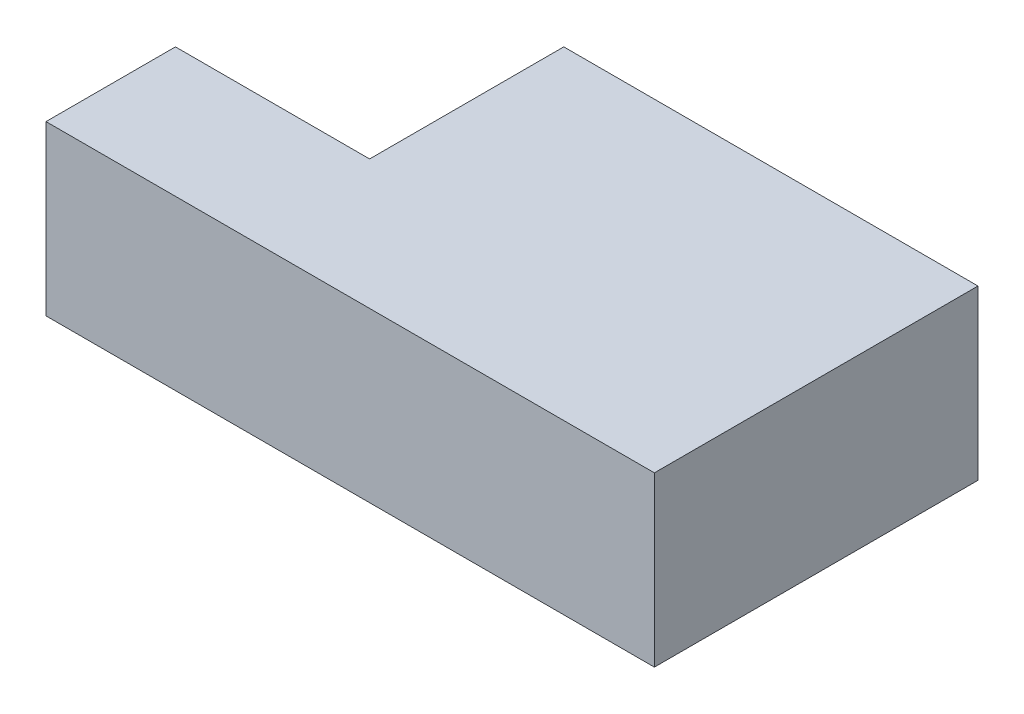
ISO-10303-21;
HEADER;
FILE_DESCRIPTION(('STEP AP214'),'2;1');
FILE_NAME('part.step','',(''),(''),'','','');
FILE_SCHEMA(('AUTOMOTIVE_DESIGN { 1 0 10303 214 1 1 1 1 }'));
ENDSEC;
DATA;
#1=APPLICATION_CONTEXT('core data for automotive mechanical design processes');
#2=APPLICATION_PROTOCOL_DEFINITION('international standard','automotive_design',2000,#1);
#3=PRODUCT_CONTEXT('',#1,'mechanical');
#4=PRODUCT('Part','Part','',(#3));
#5=PRODUCT_RELATED_PRODUCT_CATEGORY('part','',(#4));
#6=PRODUCT_DEFINITION_FORMATION('','',#4);
#7=PRODUCT_DEFINITION_CONTEXT('part definition',#1,'design');
#8=PRODUCT_DEFINITION('design','',#6,#7);
#9=PRODUCT_DEFINITION_SHAPE('','',#8);
#10=(LENGTH_UNIT() NAMED_UNIT(*) SI_UNIT(.MILLI.,.METRE.));
#11=(NAMED_UNIT(*) PLANE_ANGLE_UNIT() SI_UNIT($,.RADIAN.));
#12=(NAMED_UNIT(*) SI_UNIT($,.STERADIAN.) SOLID_ANGLE_UNIT());
#13=UNCERTAINTY_MEASURE_WITH_UNIT(LENGTH_MEASURE(1.E-05),#10,'distance_accuracy_value','');
#14=(GEOMETRIC_REPRESENTATION_CONTEXT(3) GLOBAL_UNCERTAINTY_ASSIGNED_CONTEXT((#13)) GLOBAL_UNIT_ASSIGNED_CONTEXT((#10,
#11,#12)) REPRESENTATION_CONTEXT('',''));
#15=CARTESIAN_POINT('',(0.,0.,0.));
#16=DIRECTION('',(0.,0.,1.));
#17=DIRECTION('',(1.,0.,0.));
#18=AXIS2_PLACEMENT_3D('',#15,#16,#17);
#19=CARTESIAN_POINT('',(-47.,13.,0.));
#20=DIRECTION('',(0.,0.,-1.));
#21=DIRECTION('',(-1.,0.,0.));
#22=AXIS2_PLACEMENT_3D('',#19,#20,#21);
#23=PLANE('',#22);
#24=DIRECTION('',(1.,0.,0.));
#25=VECTOR('',#24,1.);
#26=CARTESIAN_POINT('',(-47.,0.,0.));
#27=LINE('',#26,#25);
#28=CARTESIAN_POINT('',(-47.,0.,0.));
#29=VERTEX_POINT('',#28);
#30=CARTESIAN_POINT('',(0.,0.,0.));
#31=VERTEX_POINT('',#30);
#32=EDGE_CURVE('E131',#29,#31,#27,.T.);
#33=ORIENTED_EDGE('',*,*,#32,.T.);
#34=DIRECTION('',(0.,-1.,0.));
#35=VECTOR('',#34,1.);
#36=CARTESIAN_POINT('',(0.,13.,0.));
#37=LINE('',#36,#35);
#38=CARTESIAN_POINT('',(0.,13.,0.));
#39=VERTEX_POINT('',#38);
#40=EDGE_CURVE('E12',#39,#31,#37,.T.);
#41=ORIENTED_EDGE('',*,*,#40,.F.);
#42=DIRECTION('',(1.,0.,0.));
#43=VECTOR('',#42,1.);
#44=CARTESIAN_POINT('',(-47.,13.,0.));
#45=LINE('',#44,#43);
#46=CARTESIAN_POINT('',(-47.,13.,0.));
#47=VERTEX_POINT('',#46);
#48=EDGE_CURVE('E143',#47,#39,#45,.T.);
#49=ORIENTED_EDGE('',*,*,#48,.F.);
#50=DIRECTION('',(0.,-1.,0.));
#51=VECTOR('',#50,1.);
#52=CARTESIAN_POINT('',(-47.,13.,0.));
#53=LINE('',#52,#51);
#54=EDGE_CURVE('E127',#47,#29,#53,.T.);
#55=ORIENTED_EDGE('',*,*,#54,.T.);
#56=EDGE_LOOP('',(#33,#41,#49,#55));
#57=FACE_BOUND('',#56,.T.);
#58=ADVANCED_FACE('F35',(#57),#23,.F.);
#59=CARTESIAN_POINT('',(0.,13.,0.));
#60=DIRECTION('',(-1.,0.,0.));
#61=DIRECTION('',(0.,0.,1.));
#62=AXIS2_PLACEMENT_3D('',#59,#60,#61);
#63=PLANE('',#62);
#64=DIRECTION('',(0.,0.,-1.));
#65=VECTOR('',#64,1.);
#66=CARTESIAN_POINT('',(0.,0.,0.));
#67=LINE('',#66,#65);
#68=CARTESIAN_POINT('',(0.,0.,-25.));
#69=VERTEX_POINT('',#68);
#70=EDGE_CURVE('E134',#31,#69,#67,.T.);
#71=ORIENTED_EDGE('',*,*,#70,.T.);
#72=DIRECTION('',(0.,-1.,0.));
#73=VECTOR('',#72,1.);
#74=CARTESIAN_POINT('',(0.,13.,-25.));
#75=LINE('',#74,#73);
#76=CARTESIAN_POINT('',(0.,13.,-25.));
#77=VERTEX_POINT('',#76);
#78=EDGE_CURVE('E42',#77,#69,#75,.T.);
#79=ORIENTED_EDGE('',*,*,#78,.F.);
#80=DIRECTION('',(0.,0.,-1.));
#81=VECTOR('',#80,1.);
#82=CARTESIAN_POINT('',(0.,13.,0.));
#83=LINE('',#82,#81);
#84=EDGE_CURVE('E93',#39,#77,#83,.T.);
#85=ORIENTED_EDGE('',*,*,#84,.F.);
#86=ORIENTED_EDGE('',*,*,#40,.T.);
#87=EDGE_LOOP('',(#71,#79,#85,#86));
#88=FACE_BOUND('',#87,.T.);
#89=ADVANCED_FACE('F265',(#88),#63,.F.);
#90=CARTESIAN_POINT('',(0.,13.,-25.));
#91=DIRECTION('',(0.,0.,1.));
#92=DIRECTION('',(1.,0.,0.));
#93=AXIS2_PLACEMENT_3D('',#90,#91,#92);
#94=PLANE('',#93);
#95=DIRECTION('',(-1.,0.,0.));
#96=VECTOR('',#95,1.);
#97=CARTESIAN_POINT('',(0.,0.,-25.));
#98=LINE('',#97,#96);
#99=CARTESIAN_POINT('',(-32.,0.,-25.));
#100=VERTEX_POINT('',#99);
#101=EDGE_CURVE('E137',#69,#100,#98,.T.);
#102=ORIENTED_EDGE('',*,*,#101,.T.);
#103=DIRECTION('',(0.,-1.,0.));
#104=VECTOR('',#103,1.);
#105=CARTESIAN_POINT('',(-32.,13.,-25.));
#106=LINE('',#105,#104);
#107=CARTESIAN_POINT('',(-32.,13.,-25.));
#108=VERTEX_POINT('',#107);
#109=EDGE_CURVE('E122',#108,#100,#106,.T.);
#110=ORIENTED_EDGE('',*,*,#109,.F.);
#111=DIRECTION('',(-1.,0.,0.));
#112=VECTOR('',#111,1.);
#113=CARTESIAN_POINT('',(0.,13.,-25.));
#114=LINE('',#113,#112);
#115=EDGE_CURVE('E110',#77,#108,#114,.T.);
#116=ORIENTED_EDGE('',*,*,#115,.F.);
#117=ORIENTED_EDGE('',*,*,#78,.T.);
#118=EDGE_LOOP('',(#102,#110,#116,#117));
#119=FACE_BOUND('',#118,.T.);
#120=ADVANCED_FACE('F149',(#119),#94,.F.);
#121=CARTESIAN_POINT('',(-32.,13.,-25.));
#122=DIRECTION('',(1.,0.,0.));
#123=DIRECTION('',(0.,0.,-1.));
#124=AXIS2_PLACEMENT_3D('',#121,#122,#123);
#125=PLANE('',#124);
#126=DIRECTION('',(0.,0.,1.));
#127=VECTOR('',#126,1.);
#128=CARTESIAN_POINT('',(-32.,0.,-25.));
#129=LINE('',#128,#127);
#130=CARTESIAN_POINT('',(-32.,0.,-10.));
#131=VERTEX_POINT('',#130);
#132=EDGE_CURVE('E119',#100,#131,#129,.T.);
#133=ORIENTED_EDGE('',*,*,#132,.T.);
#134=DIRECTION('',(0.,-1.,0.));
#135=VECTOR('',#134,1.);
#136=CARTESIAN_POINT('',(-32.,13.,-10.));
#137=LINE('',#136,#135);
#138=CARTESIAN_POINT('',(-32.,13.,-10.));
#139=VERTEX_POINT('',#138);
#140=EDGE_CURVE('E116',#139,#131,#137,.T.);
#141=ORIENTED_EDGE('',*,*,#140,.F.);
#142=DIRECTION('',(0.,0.,1.));
#143=VECTOR('',#142,1.);
#144=CARTESIAN_POINT('',(-32.,13.,-25.));
#145=LINE('',#144,#143);
#146=EDGE_CURVE('E103',#108,#139,#145,.T.);
#147=ORIENTED_EDGE('',*,*,#146,.F.);
#148=ORIENTED_EDGE('',*,*,#109,.T.);
#149=EDGE_LOOP('',(#133,#141,#147,#148));
#150=FACE_BOUND('',#149,.T.);
#151=ADVANCED_FACE('F117',(#150),#125,.F.);
#152=CARTESIAN_POINT('',(-32.,13.,-10.));
#153=DIRECTION('',(0.,0.,1.));
#154=DIRECTION('',(1.,0.,0.));
#155=AXIS2_PLACEMENT_3D('',#152,#153,#154);
#156=PLANE('',#155);
#157=DIRECTION('',(-1.,0.,0.));
#158=VECTOR('',#157,1.);
#159=CARTESIAN_POINT('',(-32.,0.,-10.));
#160=LINE('',#159,#158);
#161=CARTESIAN_POINT('',(-47.,0.,-10.));
#162=VERTEX_POINT('',#161);
#163=EDGE_CURVE('E140',#131,#162,#160,.T.);
#164=ORIENTED_EDGE('',*,*,#163,.T.);
#165=DIRECTION('',(0.,-1.,0.));
#166=VECTOR('',#165,1.);
#167=CARTESIAN_POINT('',(-47.,13.,-10.));
#168=LINE('',#167,#166);
#169=CARTESIAN_POINT('',(-47.,13.,-10.));
#170=VERTEX_POINT('',#169);
#171=EDGE_CURVE('E123',#170,#162,#168,.T.);
#172=ORIENTED_EDGE('',*,*,#171,.F.);
#173=DIRECTION('',(-1.,0.,0.));
#174=VECTOR('',#173,1.);
#175=CARTESIAN_POINT('',(-32.,13.,-10.));
#176=LINE('',#175,#174);
#177=EDGE_CURVE('E107',#139,#170,#176,.T.);
#178=ORIENTED_EDGE('',*,*,#177,.F.);
#179=ORIENTED_EDGE('',*,*,#140,.T.);
#180=EDGE_LOOP('',(#164,#172,#178,#179));
#181=FACE_BOUND('',#180,.T.);
#182=ADVANCED_FACE('F125',(#181),#156,.F.);
#183=CARTESIAN_POINT('',(-47.,13.,-10.));
#184=DIRECTION('',(1.,0.,0.));
#185=DIRECTION('',(0.,0.,-1.));
#186=AXIS2_PLACEMENT_3D('',#183,#184,#185);
#187=PLANE('',#186);
#188=DIRECTION('',(0.,0.,1.));
#189=VECTOR('',#188,1.);
#190=CARTESIAN_POINT('',(-47.,0.,-10.));
#191=LINE('',#190,#189);
#192=EDGE_CURVE('E85',#162,#29,#191,.T.);
#193=ORIENTED_EDGE('',*,*,#192,.T.);
#194=ORIENTED_EDGE('',*,*,#54,.F.);
#195=DIRECTION('',(0.,0.,1.));
#196=VECTOR('',#195,1.);
#197=CARTESIAN_POINT('',(-47.,13.,-10.));
#198=LINE('',#197,#196);
#199=EDGE_CURVE('E58',#170,#47,#198,.T.);
#200=ORIENTED_EDGE('',*,*,#199,.F.);
#201=ORIENTED_EDGE('',*,*,#171,.T.);
#202=EDGE_LOOP('',(#193,#194,#200,#201));
#203=FACE_BOUND('',#202,.T.);
#204=ADVANCED_FACE('F153',(#203),#187,.F.);
#205=CARTESIAN_POINT('',(0.,13.,0.));
#206=DIRECTION('',(0.,1.,0.));
#207=DIRECTION('',(0.,0.,1.));
#208=AXIS2_PLACEMENT_3D('',#205,#206,#207);
#209=PLANE('',#208);
#210=ORIENTED_EDGE('',*,*,#48,.T.);
#211=ORIENTED_EDGE('',*,*,#84,.T.);
#212=ORIENTED_EDGE('',*,*,#115,.T.);
#213=ORIENTED_EDGE('',*,*,#146,.T.);
#214=ORIENTED_EDGE('',*,*,#177,.T.);
#215=ORIENTED_EDGE('',*,*,#199,.T.);
#216=EDGE_LOOP('',(#210,#211,#212,#213,#214,#215));
#217=FACE_BOUND('',#216,.T.);
#218=ADVANCED_FACE('F105',(#217),#209,.T.);
#219=CARTESIAN_POINT('',(0.,0.,0.));
#220=DIRECTION('',(0.,1.,0.));
#221=DIRECTION('',(0.,0.,1.));
#222=AXIS2_PLACEMENT_3D('',#219,#220,#221);
#223=PLANE('',#222);
#224=DIRECTION('',(0.,0.,-1.));
#225=VECTOR('',#224,1.);
#226=CARTESIAN_POINT('',(-45.,0.,-2.));
#227=LINE('',#226,#225);
#228=CARTESIAN_POINT('',(-45.,0.,-2.));
#229=VERTEX_POINT('',#228);
#230=CARTESIAN_POINT('',(-45.,0.,-8.));
#231=VERTEX_POINT('',#230);
#232=EDGE_CURVE('E199',#229,#231,#227,.T.);
#233=ORIENTED_EDGE('',*,*,#232,.F.);
#234=DIRECTION('',(-1.,0.,0.));
#235=VECTOR('',#234,1.);
#236=CARTESIAN_POINT('',(-2.,0.,-2.));
#237=LINE('',#236,#235);
#238=CARTESIAN_POINT('',(-2.,0.,-2.));
#239=VERTEX_POINT('',#238);
#240=EDGE_CURVE('E196',#239,#229,#237,.T.);
#241=ORIENTED_EDGE('',*,*,#240,.F.);
#242=DIRECTION('',(0.,0.,1.));
#243=VECTOR('',#242,1.);
#244=CARTESIAN_POINT('',(-2.00000000000001,0.,-23.));
#245=LINE('',#244,#243);
#246=CARTESIAN_POINT('',(-2.00000000000001,0.,-23.));
#247=VERTEX_POINT('',#246);
#248=EDGE_CURVE('E193',#247,#239,#245,.T.);
#249=ORIENTED_EDGE('',*,*,#248,.F.);
#250=DIRECTION('',(1.,0.,0.));
#251=VECTOR('',#250,1.);
#252=CARTESIAN_POINT('',(-30.,0.,-23.));
#253=LINE('',#252,#251);
#254=CARTESIAN_POINT('',(-30.,0.,-23.));
#255=VERTEX_POINT('',#254);
#256=EDGE_CURVE('E49',#255,#247,#253,.T.);
#257=ORIENTED_EDGE('',*,*,#256,.F.);
#258=DIRECTION('',(0.,0.,-1.));
#259=VECTOR('',#258,1.);
#260=CARTESIAN_POINT('',(-30.,0.,-8.));
#261=LINE('',#260,#259);
#262=CARTESIAN_POINT('',(-30.,0.,-8.));
#263=VERTEX_POINT('',#262);
#264=EDGE_CURVE('E205',#263,#255,#261,.T.);
#265=ORIENTED_EDGE('',*,*,#264,.F.);
#266=DIRECTION('',(1.,0.,0.));
#267=VECTOR('',#266,1.);
#268=CARTESIAN_POINT('',(-45.,0.,-8.));
#269=LINE('',#268,#267);
#270=EDGE_CURVE('E202',#231,#263,#269,.T.);
#271=ORIENTED_EDGE('',*,*,#270,.F.);
#272=EDGE_LOOP('',(#233,#241,#249,#257,#265,#271));
#273=FACE_BOUND('',#272,.T.);
#274=ORIENTED_EDGE('',*,*,#32,.F.);
#275=ORIENTED_EDGE('',*,*,#192,.F.);
#276=ORIENTED_EDGE('',*,*,#163,.F.);
#277=ORIENTED_EDGE('',*,*,#132,.F.);
#278=ORIENTED_EDGE('',*,*,#101,.F.);
#279=ORIENTED_EDGE('',*,*,#70,.F.);
#280=EDGE_LOOP('',(#274,#275,#276,#277,#278,#279));
#281=FACE_BOUND('',#280,.T.);
#282=ADVANCED_FACE('F152',(#273,#281),#223,.F.);
#283=CARTESIAN_POINT('',(0.,11.,0.));
#284=DIRECTION('',(0.,1.,0.));
#285=DIRECTION('',(0.,0.,1.));
#286=AXIS2_PLACEMENT_3D('',#283,#284,#285);
#287=PLANE('',#286);
#288=DIRECTION('',(0.,0.,1.));
#289=VECTOR('',#288,1.);
#290=CARTESIAN_POINT('',(-2.00000000000001,11.,-23.));
#291=LINE('',#290,#289);
#292=CARTESIAN_POINT('',(-2.00000000000001,11.,-23.));
#293=VERTEX_POINT('',#292);
#294=CARTESIAN_POINT('',(-2.,11.,-2.));
#295=VERTEX_POINT('',#294);
#296=EDGE_CURVE('E162',#293,#295,#291,.T.);
#297=ORIENTED_EDGE('',*,*,#296,.T.);
#298=DIRECTION('',(-1.,0.,0.));
#299=VECTOR('',#298,1.);
#300=CARTESIAN_POINT('',(-2.,11.,-2.));
#301=LINE('',#300,#299);
#302=CARTESIAN_POINT('',(-45.,11.,-2.));
#303=VERTEX_POINT('',#302);
#304=EDGE_CURVE('E167',#295,#303,#301,.T.);
#305=ORIENTED_EDGE('',*,*,#304,.T.);
#306=DIRECTION('',(0.,0.,-1.));
#307=VECTOR('',#306,1.);
#308=CARTESIAN_POINT('',(-45.,11.,-2.));
#309=LINE('',#308,#307);
#310=CARTESIAN_POINT('',(-45.,11.,-8.));
#311=VERTEX_POINT('',#310);
#312=EDGE_CURVE('E166',#303,#311,#309,.T.);
#313=ORIENTED_EDGE('',*,*,#312,.T.);
#314=DIRECTION('',(1.,0.,0.));
#315=VECTOR('',#314,1.);
#316=CARTESIAN_POINT('',(-45.,11.,-8.));
#317=LINE('',#316,#315);
#318=CARTESIAN_POINT('',(-30.,11.,-8.));
#319=VERTEX_POINT('',#318);
#320=EDGE_CURVE('E171',#311,#319,#317,.T.);
#321=ORIENTED_EDGE('',*,*,#320,.T.);
#322=DIRECTION('',(0.,0.,-1.));
#323=VECTOR('',#322,1.);
#324=CARTESIAN_POINT('',(-30.,11.,-8.));
#325=LINE('',#324,#323);
#326=CARTESIAN_POINT('',(-30.,11.,-23.));
#327=VERTEX_POINT('',#326);
#328=EDGE_CURVE('E175',#319,#327,#325,.T.);
#329=ORIENTED_EDGE('',*,*,#328,.T.);
#330=DIRECTION('',(1.,0.,0.));
#331=VECTOR('',#330,1.);
#332=CARTESIAN_POINT('',(-30.,11.,-23.));
#333=LINE('',#332,#331);
#334=EDGE_CURVE('E178',#327,#293,#333,.T.);
#335=ORIENTED_EDGE('',*,*,#334,.T.);
#336=EDGE_LOOP('',(#297,#305,#313,#321,#329,#335));
#337=FACE_BOUND('',#336,.T.);
#338=ADVANCED_FACE('F254',(#337),#287,.F.);
#339=CARTESIAN_POINT('',(-2.,60.8539444560216,-2.));
#340=DIRECTION('',(0.,0.,1.));
#341=DIRECTION('',(1.,0.,0.));
#342=AXIS2_PLACEMENT_3D('',#339,#340,#341);
#343=PLANE('',#342);
#344=DIRECTION('',(0.,-1.,0.));
#345=VECTOR('',#344,1.);
#346=CARTESIAN_POINT('',(-2.,60.8539444560216,-2.));
#347=LINE('',#346,#345);
#348=EDGE_CURVE('E135',#295,#239,#347,.T.);
#349=ORIENTED_EDGE('',*,*,#348,.T.);
#350=ORIENTED_EDGE('',*,*,#240,.T.);
#351=DIRECTION('',(0.,-1.,0.));
#352=VECTOR('',#351,1.);
#353=CARTESIAN_POINT('',(-45.,60.8539444560216,-2.));
#354=LINE('',#353,#352);
#355=EDGE_CURVE('E163',#303,#229,#354,.T.);
#356=ORIENTED_EDGE('',*,*,#355,.F.);
#357=ORIENTED_EDGE('',*,*,#304,.F.);
#358=EDGE_LOOP('',(#349,#350,#356,#357));
#359=FACE_BOUND('',#358,.T.);
#360=ADVANCED_FACE('F251',(#359),#343,.F.);
#361=CARTESIAN_POINT('',(-45.,60.8539444560216,-2.));
#362=DIRECTION('',(-1.,0.,0.));
#363=DIRECTION('',(0.,0.,1.));
#364=AXIS2_PLACEMENT_3D('',#361,#362,#363);
#365=PLANE('',#364);
#366=ORIENTED_EDGE('',*,*,#355,.T.);
#367=ORIENTED_EDGE('',*,*,#232,.T.);
#368=DIRECTION('',(0.,-1.,0.));
#369=VECTOR('',#368,1.);
#370=CARTESIAN_POINT('',(-45.,60.8539444560216,-8.));
#371=LINE('',#370,#369);
#372=EDGE_CURVE('E168',#311,#231,#371,.T.);
#373=ORIENTED_EDGE('',*,*,#372,.F.);
#374=ORIENTED_EDGE('',*,*,#312,.F.);
#375=EDGE_LOOP('',(#366,#367,#373,#374));
#376=FACE_BOUND('',#375,.T.);
#377=ADVANCED_FACE('F250',(#376),#365,.F.);
#378=CARTESIAN_POINT('',(-45.,60.8539444560216,-8.));
#379=DIRECTION('',(0.,0.,-1.));
#380=DIRECTION('',(-1.,0.,0.));
#381=AXIS2_PLACEMENT_3D('',#378,#379,#380);
#382=PLANE('',#381);
#383=ORIENTED_EDGE('',*,*,#372,.T.);
#384=ORIENTED_EDGE('',*,*,#270,.T.);
#385=DIRECTION('',(0.,-1.,0.));
#386=VECTOR('',#385,1.);
#387=CARTESIAN_POINT('',(-30.,60.8539444560216,-8.));
#388=LINE('',#387,#386);
#389=EDGE_CURVE('E172',#319,#263,#388,.T.);
#390=ORIENTED_EDGE('',*,*,#389,.F.);
#391=ORIENTED_EDGE('',*,*,#320,.F.);
#392=EDGE_LOOP('',(#383,#384,#390,#391));
#393=FACE_BOUND('',#392,.T.);
#394=ADVANCED_FACE('F252',(#393),#382,.F.);
#395=CARTESIAN_POINT('',(-30.,60.8539444560216,-8.));
#396=DIRECTION('',(-1.,0.,0.));
#397=DIRECTION('',(0.,0.,1.));
#398=AXIS2_PLACEMENT_3D('',#395,#396,#397);
#399=PLANE('',#398);
#400=ORIENTED_EDGE('',*,*,#389,.T.);
#401=ORIENTED_EDGE('',*,*,#264,.T.);
#402=DIRECTION('',(0.,-1.,0.));
#403=VECTOR('',#402,1.);
#404=CARTESIAN_POINT('',(-30.,60.8539444560216,-23.));
#405=LINE('',#404,#403);
#406=EDGE_CURVE('E176',#327,#255,#405,.T.);
#407=ORIENTED_EDGE('',*,*,#406,.F.);
#408=ORIENTED_EDGE('',*,*,#328,.F.);
#409=EDGE_LOOP('',(#400,#401,#407,#408));
#410=FACE_BOUND('',#409,.T.);
#411=ADVANCED_FACE('F212',(#410),#399,.F.);
#412=CARTESIAN_POINT('',(-30.,60.8539444560216,-23.));
#413=DIRECTION('',(0.,0.,-1.));
#414=DIRECTION('',(-1.,0.,0.));
#415=AXIS2_PLACEMENT_3D('',#412,#413,#414);
#416=PLANE('',#415);
#417=ORIENTED_EDGE('',*,*,#406,.T.);
#418=ORIENTED_EDGE('',*,*,#256,.T.);
#419=DIRECTION('',(0.,-1.,0.));
#420=VECTOR('',#419,1.);
#421=CARTESIAN_POINT('',(-2.00000000000001,60.8539444560216,-23.));
#422=LINE('',#421,#420);
#423=EDGE_CURVE('E179',#293,#247,#422,.T.);
#424=ORIENTED_EDGE('',*,*,#423,.F.);
#425=ORIENTED_EDGE('',*,*,#334,.F.);
#426=EDGE_LOOP('',(#417,#418,#424,#425));
#427=FACE_BOUND('',#426,.T.);
#428=ADVANCED_FACE('F255',(#427),#416,.F.);
#429=CARTESIAN_POINT('',(-2.00000000000001,60.8539444560216,-23.));
#430=DIRECTION('',(1.,0.,0.));
#431=DIRECTION('',(0.,0.,-1.));
#432=AXIS2_PLACEMENT_3D('',#429,#430,#431);
#433=PLANE('',#432);
#434=ORIENTED_EDGE('',*,*,#423,.T.);
#435=ORIENTED_EDGE('',*,*,#248,.T.);
#436=ORIENTED_EDGE('',*,*,#348,.F.);
#437=ORIENTED_EDGE('',*,*,#296,.F.);
#438=EDGE_LOOP('',(#434,#435,#436,#437));
#439=FACE_BOUND('',#438,.T.);
#440=ADVANCED_FACE('F225',(#439),#433,.F.);
#441=CLOSED_SHELL('',(#58,#89,#120,#151,#182,#204,#218,#282,#338,#360,#377,#394,#411,#428,#440));
#442=MANIFOLD_SOLID_BREP('B2',#441);
#443=ADVANCED_BREP_SHAPE_REPRESENTATION('',(#18,#442),#14);
#444=SHAPE_DEFINITION_REPRESENTATION(#9,#443);
ENDSEC;
END-ISO-10303-21;
